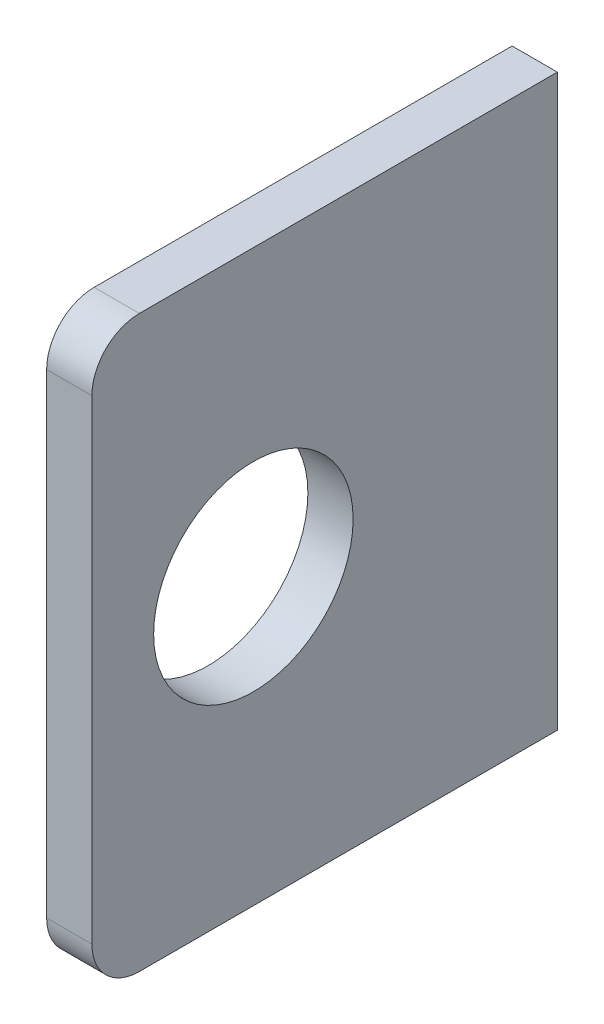
ISO-10303-21;
HEADER;
FILE_DESCRIPTION(('STEP AP214'),'2;1');
FILE_NAME('part.step','',(''),(''),'','','');
FILE_SCHEMA(('AUTOMOTIVE_DESIGN { 1 0 10303 214 1 1 1 1 }'));
ENDSEC;
DATA;
#1=APPLICATION_CONTEXT('core data for automotive mechanical design processes');
#2=APPLICATION_PROTOCOL_DEFINITION('international standard','automotive_design',2000,#1);
#3=PRODUCT_CONTEXT('',#1,'mechanical');
#4=PRODUCT('Part','Part','',(#3));
#5=PRODUCT_RELATED_PRODUCT_CATEGORY('part','',(#4));
#6=PRODUCT_DEFINITION_FORMATION('','',#4);
#7=PRODUCT_DEFINITION_CONTEXT('part definition',#1,'design');
#8=PRODUCT_DEFINITION('design','',#6,#7);
#9=PRODUCT_DEFINITION_SHAPE('','',#8);
#10=(LENGTH_UNIT() NAMED_UNIT(*) SI_UNIT(.MILLI.,.METRE.));
#11=(NAMED_UNIT(*) PLANE_ANGLE_UNIT() SI_UNIT($,.RADIAN.));
#12=(NAMED_UNIT(*) SI_UNIT($,.STERADIAN.) SOLID_ANGLE_UNIT());
#13=UNCERTAINTY_MEASURE_WITH_UNIT(LENGTH_MEASURE(1.E-05),#10,'distance_accuracy_value','');
#14=(GEOMETRIC_REPRESENTATION_CONTEXT(3) GLOBAL_UNCERTAINTY_ASSIGNED_CONTEXT((#13)) GLOBAL_UNIT_ASSIGNED_CONTEXT((#10,
#11,#12)) REPRESENTATION_CONTEXT('',''));
#15=CARTESIAN_POINT('',(0.,0.,0.));
#16=DIRECTION('',(0.,0.,1.));
#17=DIRECTION('',(1.,0.,0.));
#18=AXIS2_PLACEMENT_3D('',#15,#16,#17);
#19=CARTESIAN_POINT('',(9.525,-60.,-58.));
#20=DIRECTION('',(0.,1.,0.));
#21=DIRECTION('',(0.,0.,1.));
#22=AXIS2_PLACEMENT_3D('',#19,#20,#21);
#23=PLANE('',#22);
#24=DIRECTION('',(0.,0.,-1.));
#25=VECTOR('',#24,1.);
#26=CARTESIAN_POINT('',(9.525,-60.,-58.));
#27=LINE('',#26,#25);
#28=CARTESIAN_POINT('',(9.525,-60.,30.));
#29=VERTEX_POINT('',#28);
#30=CARTESIAN_POINT('',(9.525,-60.,-58.));
#31=VERTEX_POINT('',#30);
#32=EDGE_CURVE('E101',#29,#31,#27,.T.);
#33=ORIENTED_EDGE('',*,*,#32,.F.);
#34=DIRECTION('',(1.,0.,0.));
#35=VECTOR('',#34,1.);
#36=CARTESIAN_POINT('',(9.525,-60.,30.));
#37=LINE('',#36,#35);
#38=CARTESIAN_POINT('',(0.,-60.,30.));
#39=VERTEX_POINT('',#38);
#40=EDGE_CURVE('E67',#29,#39,#37,.F.);
#41=ORIENTED_EDGE('',*,*,#40,.T.);
#42=DIRECTION('',(0.,0.,-1.));
#43=VECTOR('',#42,1.);
#44=CARTESIAN_POINT('',(0.,-60.,-58.));
#45=LINE('',#44,#43);
#46=CARTESIAN_POINT('',(0.,-60.,-58.));
#47=VERTEX_POINT('',#46);
#48=EDGE_CURVE('E113',#39,#47,#45,.T.);
#49=ORIENTED_EDGE('',*,*,#48,.T.);
#50=DIRECTION('',(-1.,0.,0.));
#51=VECTOR('',#50,1.);
#52=CARTESIAN_POINT('',(9.525,-60.,-58.));
#53=LINE('',#52,#51);
#54=EDGE_CURVE('E111',#31,#47,#53,.T.);
#55=ORIENTED_EDGE('',*,*,#54,.F.);
#56=EDGE_LOOP('',(#33,#41,#49,#55));
#57=FACE_BOUND('',#56,.T.);
#58=ADVANCED_FACE('F46',(#57),#23,.F.);
#59=CARTESIAN_POINT('',(9.525,0.,0.));
#60=DIRECTION('',(-1.,0.,0.));
#61=DIRECTION('',(0.,0.,1.));
#62=AXIS2_PLACEMENT_3D('',#59,#60,#61);
#63=PLANE('',#62);
#64=CARTESIAN_POINT('',(9.525,0.,6.00000000000001));
#65=DIRECTION('',(1.,0.,0.));
#66=DIRECTION('',(0.,0.,-1.));
#67=AXIS2_PLACEMENT_3D('',#64,#65,#66);
#68=CIRCLE('',#67,21.);
#69=CARTESIAN_POINT('',(9.525,0.,-15.));
#70=VERTEX_POINT('',#69);
#71=EDGE_CURVE('E167',#70,#70,#68,.T.);
#72=ORIENTED_EDGE('',*,*,#71,.F.);
#73=EDGE_LOOP('',(#72));
#74=FACE_BOUND('',#73,.T.);
#75=DIRECTION('',(0.,1.,0.));
#76=VECTOR('',#75,1.);
#77=CARTESIAN_POINT('',(9.525,-60.,40.));
#78=LINE('',#77,#76);
#79=CARTESIAN_POINT('',(9.525,-50.,40.));
#80=VERTEX_POINT('',#79);
#81=CARTESIAN_POINT('',(9.525,50.,40.));
#82=VERTEX_POINT('',#81);
#83=EDGE_CURVE('E170',#80,#82,#78,.T.);
#84=ORIENTED_EDGE('',*,*,#83,.F.);
#85=CARTESIAN_POINT('',(9.525,-50.,30.));
#86=DIRECTION('',(-1.,0.,0.));
#87=DIRECTION('',(0.,0.,1.));
#88=AXIS2_PLACEMENT_3D('',#85,#86,#87);
#89=CIRCLE('',#88,10.);
#90=EDGE_CURVE('E108',#80,#29,#89,.F.);
#91=ORIENTED_EDGE('',*,*,#90,.T.);
#92=ORIENTED_EDGE('',*,*,#32,.T.);
#93=DIRECTION('',(0.,1.,0.));
#94=VECTOR('',#93,1.);
#95=CARTESIAN_POINT('',(9.525,-60.,-58.));
#96=LINE('',#95,#94);
#97=CARTESIAN_POINT('',(9.525,60.,-58.));
#98=VERTEX_POINT('',#97);
#99=EDGE_CURVE('E110',#31,#98,#96,.T.);
#100=ORIENTED_EDGE('',*,*,#99,.T.);
#101=DIRECTION('',(0.,0.,1.));
#102=VECTOR('',#101,1.);
#103=CARTESIAN_POINT('',(9.525,60.,-58.));
#104=LINE('',#103,#102);
#105=CARTESIAN_POINT('',(9.525,60.,30.));
#106=VERTEX_POINT('',#105);
#107=EDGE_CURVE('E112',#98,#106,#104,.T.);
#108=ORIENTED_EDGE('',*,*,#107,.T.);
#109=CARTESIAN_POINT('',(9.525,50.,30.));
#110=DIRECTION('',(-1.,0.,0.));
#111=DIRECTION('',(0.,0.,1.));
#112=AXIS2_PLACEMENT_3D('',#109,#110,#111);
#113=CIRCLE('',#112,10.);
#114=EDGE_CURVE('E148',#106,#82,#113,.F.);
#115=ORIENTED_EDGE('',*,*,#114,.T.);
#116=EDGE_LOOP('',(#84,#91,#92,#100,#108,#115));
#117=FACE_BOUND('',#116,.T.);
#118=ADVANCED_FACE('F102',(#74,#117),#63,.F.);
#119=CARTESIAN_POINT('',(0.,0.,0.));
#120=DIRECTION('',(-1.,0.,0.));
#121=DIRECTION('',(0.,0.,1.));
#122=AXIS2_PLACEMENT_3D('',#119,#120,#121);
#123=PLANE('',#122);
#124=CARTESIAN_POINT('',(0.,0.,6.00000000000001));
#125=DIRECTION('',(1.,0.,0.));
#126=DIRECTION('',(0.,0.,-1.));
#127=AXIS2_PLACEMENT_3D('',#124,#125,#126);
#128=CIRCLE('',#127,21.);
#129=CARTESIAN_POINT('',(0.,0.,-15.));
#130=VERTEX_POINT('',#129);
#131=EDGE_CURVE('E201',#130,#130,#128,.T.);
#132=ORIENTED_EDGE('',*,*,#131,.T.);
#133=EDGE_LOOP('',(#132));
#134=FACE_BOUND('',#133,.T.);
#135=ORIENTED_EDGE('',*,*,#48,.F.);
#136=CARTESIAN_POINT('',(0.,-50.,30.));
#137=DIRECTION('',(-1.,0.,0.));
#138=DIRECTION('',(0.,0.,1.));
#139=AXIS2_PLACEMENT_3D('',#136,#137,#138);
#140=CIRCLE('',#139,10.);
#141=CARTESIAN_POINT('',(0.,-50.,40.));
#142=VERTEX_POINT('',#141);
#143=EDGE_CURVE('E54',#39,#142,#140,.T.);
#144=ORIENTED_EDGE('',*,*,#143,.T.);
#145=DIRECTION('',(0.,1.,0.));
#146=VECTOR('',#145,1.);
#147=CARTESIAN_POINT('',(0.,-60.,40.));
#148=LINE('',#147,#146);
#149=CARTESIAN_POINT('',(0.,50.,40.));
#150=VERTEX_POINT('',#149);
#151=EDGE_CURVE('E158',#142,#150,#148,.T.);
#152=ORIENTED_EDGE('',*,*,#151,.T.);
#153=CARTESIAN_POINT('',(0.,50.,30.));
#154=DIRECTION('',(-1.,0.,0.));
#155=DIRECTION('',(0.,0.,1.));
#156=AXIS2_PLACEMENT_3D('',#153,#154,#155);
#157=CIRCLE('',#156,10.);
#158=CARTESIAN_POINT('',(0.,60.,30.));
#159=VERTEX_POINT('',#158);
#160=EDGE_CURVE('E61',#150,#159,#157,.T.);
#161=ORIENTED_EDGE('',*,*,#160,.T.);
#162=DIRECTION('',(0.,0.,1.));
#163=VECTOR('',#162,1.);
#164=CARTESIAN_POINT('',(0.,60.,-58.));
#165=LINE('',#164,#163);
#166=CARTESIAN_POINT('',(0.,60.,-58.));
#167=VERTEX_POINT('',#166);
#168=EDGE_CURVE('E134',#167,#159,#165,.T.);
#169=ORIENTED_EDGE('',*,*,#168,.F.);
#170=DIRECTION('',(0.,1.,0.));
#171=VECTOR('',#170,1.);
#172=CARTESIAN_POINT('',(0.,-60.,-58.));
#173=LINE('',#172,#171);
#174=EDGE_CURVE('E136',#47,#167,#173,.T.);
#175=ORIENTED_EDGE('',*,*,#174,.F.);
#176=EDGE_LOOP('',(#135,#144,#152,#161,#169,#175));
#177=FACE_BOUND('',#176,.T.);
#178=ADVANCED_FACE('F160',(#134,#177),#123,.T.);
#179=CARTESIAN_POINT('',(9.525,60.,-58.));
#180=DIRECTION('',(0.,-1.,0.));
#181=DIRECTION('',(0.,0.,-1.));
#182=AXIS2_PLACEMENT_3D('',#179,#180,#181);
#183=PLANE('',#182);
#184=ORIENTED_EDGE('',*,*,#168,.T.);
#185=DIRECTION('',(1.,0.,0.));
#186=VECTOR('',#185,1.);
#187=CARTESIAN_POINT('',(9.525,60.,30.));
#188=LINE('',#187,#186);
#189=EDGE_CURVE('E11',#159,#106,#188,.T.);
#190=ORIENTED_EDGE('',*,*,#189,.T.);
#191=ORIENTED_EDGE('',*,*,#107,.F.);
#192=DIRECTION('',(-1.,0.,0.));
#193=VECTOR('',#192,1.);
#194=CARTESIAN_POINT('',(9.525,60.,-58.));
#195=LINE('',#194,#193);
#196=EDGE_CURVE('E117',#98,#167,#195,.T.);
#197=ORIENTED_EDGE('',*,*,#196,.T.);
#198=EDGE_LOOP('',(#184,#190,#191,#197));
#199=FACE_BOUND('',#198,.T.);
#200=ADVANCED_FACE('F188',(#199),#183,.F.);
#201=CARTESIAN_POINT('',(9.525,-60.,-58.));
#202=DIRECTION('',(0.,0.,1.));
#203=DIRECTION('',(1.,0.,0.));
#204=AXIS2_PLACEMENT_3D('',#201,#202,#203);
#205=PLANE('',#204);
#206=CARTESIAN_POINT('',(4.76250000000001,0.,-58.));
#207=DIRECTION('',(0.,0.,-1.));
#208=DIRECTION('',(-1.,0.,0.));
#209=AXIS2_PLACEMENT_3D('',#206,#207,#208);
#210=CIRCLE('',#209,1.65);
#211=CARTESIAN_POINT('',(3.11250000000001,0.,-58.));
#212=VERTEX_POINT('',#211);
#213=EDGE_CURVE('E226',#212,#212,#210,.T.);
#214=ORIENTED_EDGE('',*,*,#213,.F.);
#215=EDGE_LOOP('',(#214));
#216=FACE_BOUND('',#215,.T.);
#217=CARTESIAN_POINT('',(4.76250000000001,27.,-58.));
#218=DIRECTION('',(0.,0.,-1.));
#219=DIRECTION('',(-1.,0.,0.));
#220=AXIS2_PLACEMENT_3D('',#217,#218,#219);
#221=CIRCLE('',#220,1.65);
#222=CARTESIAN_POINT('',(3.11250000000001,27.,-58.));
#223=VERTEX_POINT('',#222);
#224=EDGE_CURVE('E237',#223,#223,#221,.T.);
#225=ORIENTED_EDGE('',*,*,#224,.F.);
#226=EDGE_LOOP('',(#225));
#227=FACE_BOUND('',#226,.T.);
#228=CARTESIAN_POINT('',(4.76250000000001,54.,-58.));
#229=DIRECTION('',(0.,0.,-1.));
#230=DIRECTION('',(-1.,0.,0.));
#231=AXIS2_PLACEMENT_3D('',#228,#229,#230);
#232=CIRCLE('',#231,1.65);
#233=CARTESIAN_POINT('',(3.11250000000001,54.,-58.));
#234=VERTEX_POINT('',#233);
#235=EDGE_CURVE('E211',#234,#234,#232,.T.);
#236=ORIENTED_EDGE('',*,*,#235,.F.);
#237=EDGE_LOOP('',(#236));
#238=FACE_BOUND('',#237,.T.);
#239=CARTESIAN_POINT('',(4.76250000000001,-54.,-58.));
#240=DIRECTION('',(0.,0.,-1.));
#241=DIRECTION('',(-1.,0.,0.));
#242=AXIS2_PLACEMENT_3D('',#239,#240,#241);
#243=CIRCLE('',#242,1.65);
#244=CARTESIAN_POINT('',(3.11250000000001,-54.,-58.));
#245=VERTEX_POINT('',#244);
#246=EDGE_CURVE('E219',#245,#245,#243,.T.);
#247=ORIENTED_EDGE('',*,*,#246,.F.);
#248=EDGE_LOOP('',(#247));
#249=FACE_BOUND('',#248,.T.);
#250=CARTESIAN_POINT('',(4.76250000000001,-27.,-58.));
#251=DIRECTION('',(0.,0.,-1.));
#252=DIRECTION('',(-1.,0.,0.));
#253=AXIS2_PLACEMENT_3D('',#250,#251,#252);
#254=CIRCLE('',#253,1.65);
#255=CARTESIAN_POINT('',(3.11250000000001,-27.,-58.));
#256=VERTEX_POINT('',#255);
#257=EDGE_CURVE('E234',#256,#256,#254,.T.);
#258=ORIENTED_EDGE('',*,*,#257,.F.);
#259=EDGE_LOOP('',(#258));
#260=FACE_BOUND('',#259,.T.);
#261=ORIENTED_EDGE('',*,*,#174,.T.);
#262=ORIENTED_EDGE('',*,*,#196,.F.);
#263=ORIENTED_EDGE('',*,*,#99,.F.);
#264=ORIENTED_EDGE('',*,*,#54,.T.);
#265=EDGE_LOOP('',(#261,#262,#263,#264));
#266=FACE_BOUND('',#265,.T.);
#267=ADVANCED_FACE('F121',(#216,#227,#238,#249,#260,#266),#205,.F.);
#268=CARTESIAN_POINT('',(4.76250000000001,-27.,-48.));
#269=DIRECTION('',(0.,0.,-1.));
#270=DIRECTION('',(-1.,0.,0.));
#271=AXIS2_PLACEMENT_3D('',#268,#269,#270);
#272=CYLINDRICAL_SURFACE('',#271,1.65);
#273=CARTESIAN_POINT('',(4.76250000000001,-27.,-48.));
#274=DIRECTION('',(0.,0.,-1.));
#275=DIRECTION('',(-1.,0.,0.));
#276=AXIS2_PLACEMENT_3D('',#273,#274,#275);
#277=CIRCLE('',#276,1.65);
#278=CARTESIAN_POINT('',(3.11250000000001,-27.,-48.));
#279=VERTEX_POINT('',#278);
#280=EDGE_CURVE('E133',#279,#279,#277,.T.);
#281=ORIENTED_EDGE('',*,*,#280,.F.);
#282=EDGE_LOOP('',(#281));
#283=FACE_BOUND('',#282,.T.);
#284=ORIENTED_EDGE('',*,*,#257,.T.);
#285=EDGE_LOOP('',(#284));
#286=FACE_BOUND('',#285,.T.);
#287=ADVANCED_FACE('F198',(#283,#286),#272,.F.);
#288=CARTESIAN_POINT('',(0.,0.,-48.));
#289=DIRECTION('',(0.,0.,-1.));
#290=DIRECTION('',(-1.,0.,0.));
#291=AXIS2_PLACEMENT_3D('',#288,#289,#290);
#292=PLANE('',#291);
#293=ORIENTED_EDGE('',*,*,#280,.T.);
#294=EDGE_LOOP('',(#293));
#295=FACE_BOUND('',#294,.T.);
#296=ADVANCED_FACE('F251',(#295),#292,.T.);
#297=CARTESIAN_POINT('',(4.76250000000001,-54.,-48.));
#298=DIRECTION('',(0.,0.,-1.));
#299=DIRECTION('',(-1.,0.,0.));
#300=AXIS2_PLACEMENT_3D('',#297,#298,#299);
#301=CYLINDRICAL_SURFACE('',#300,1.65);
#302=CARTESIAN_POINT('',(4.76250000000001,-54.,-48.));
#303=DIRECTION('',(0.,0.,-1.));
#304=DIRECTION('',(-1.,0.,0.));
#305=AXIS2_PLACEMENT_3D('',#302,#303,#304);
#306=CIRCLE('',#305,1.65);
#307=CARTESIAN_POINT('',(3.11250000000001,-54.,-48.));
#308=VERTEX_POINT('',#307);
#309=EDGE_CURVE('E210',#308,#308,#306,.T.);
#310=ORIENTED_EDGE('',*,*,#309,.F.);
#311=EDGE_LOOP('',(#310));
#312=FACE_BOUND('',#311,.T.);
#313=ORIENTED_EDGE('',*,*,#246,.T.);
#314=EDGE_LOOP('',(#313));
#315=FACE_BOUND('',#314,.T.);
#316=ADVANCED_FACE('F257',(#312,#315),#301,.F.);
#317=CARTESIAN_POINT('',(4.76250000000001,-54.,-48.));
#318=DIRECTION('',(0.,0.,-1.));
#319=DIRECTION('',(-1.,0.,0.));
#320=AXIS2_PLACEMENT_3D('',#317,#318,#319);
#321=PLANE('',#320);
#322=ORIENTED_EDGE('',*,*,#309,.T.);
#323=EDGE_LOOP('',(#322));
#324=FACE_BOUND('',#323,.T.);
#325=ADVANCED_FACE('F281',(#324),#321,.T.);
#326=CARTESIAN_POINT('',(4.76250000000001,54.,-48.));
#327=DIRECTION('',(0.,0.,-1.));
#328=DIRECTION('',(-1.,0.,0.));
#329=AXIS2_PLACEMENT_3D('',#326,#327,#328);
#330=CYLINDRICAL_SURFACE('',#329,1.65);
#331=CARTESIAN_POINT('',(4.76250000000001,54.,-48.));
#332=DIRECTION('',(0.,0.,-1.));
#333=DIRECTION('',(-1.,0.,0.));
#334=AXIS2_PLACEMENT_3D('',#331,#332,#333);
#335=CIRCLE('',#334,1.65);
#336=CARTESIAN_POINT('',(3.11250000000001,54.,-48.));
#337=VERTEX_POINT('',#336);
#338=EDGE_CURVE('E216',#337,#337,#335,.T.);
#339=ORIENTED_EDGE('',*,*,#338,.F.);
#340=EDGE_LOOP('',(#339));
#341=FACE_BOUND('',#340,.T.);
#342=ORIENTED_EDGE('',*,*,#235,.T.);
#343=EDGE_LOOP('',(#342));
#344=FACE_BOUND('',#343,.T.);
#345=ADVANCED_FACE('F282',(#341,#344),#330,.F.);
#346=CARTESIAN_POINT('',(0.,0.,-48.));
#347=DIRECTION('',(0.,0.,-1.));
#348=DIRECTION('',(-1.,0.,0.));
#349=AXIS2_PLACEMENT_3D('',#346,#347,#348);
#350=PLANE('',#349);
#351=ORIENTED_EDGE('',*,*,#338,.T.);
#352=EDGE_LOOP('',(#351));
#353=FACE_BOUND('',#352,.T.);
#354=ADVANCED_FACE('F272',(#353),#350,.T.);
#355=CARTESIAN_POINT('',(4.76250000000001,27.,-48.));
#356=DIRECTION('',(0.,0.,-1.));
#357=DIRECTION('',(-1.,0.,0.));
#358=AXIS2_PLACEMENT_3D('',#355,#356,#357);
#359=CYLINDRICAL_SURFACE('',#358,1.65);
#360=CARTESIAN_POINT('',(4.76250000000001,27.,-48.));
#361=DIRECTION('',(0.,0.,-1.));
#362=DIRECTION('',(-1.,0.,0.));
#363=AXIS2_PLACEMENT_3D('',#360,#361,#362);
#364=CIRCLE('',#363,1.65);
#365=CARTESIAN_POINT('',(3.11250000000001,27.,-48.));
#366=VERTEX_POINT('',#365);
#367=EDGE_CURVE('E214',#366,#366,#364,.T.);
#368=ORIENTED_EDGE('',*,*,#367,.F.);
#369=EDGE_LOOP('',(#368));
#370=FACE_BOUND('',#369,.T.);
#371=ORIENTED_EDGE('',*,*,#224,.T.);
#372=EDGE_LOOP('',(#371));
#373=FACE_BOUND('',#372,.T.);
#374=ADVANCED_FACE('F267',(#370,#373),#359,.F.);
#375=CARTESIAN_POINT('',(0.,0.,-48.));
#376=DIRECTION('',(0.,0.,-1.));
#377=DIRECTION('',(-1.,0.,0.));
#378=AXIS2_PLACEMENT_3D('',#375,#376,#377);
#379=PLANE('',#378);
#380=ORIENTED_EDGE('',*,*,#367,.T.);
#381=EDGE_LOOP('',(#380));
#382=FACE_BOUND('',#381,.T.);
#383=ADVANCED_FACE('F264',(#382),#379,.T.);
#384=CARTESIAN_POINT('',(4.76250000000001,0.,-48.));
#385=DIRECTION('',(0.,0.,-1.));
#386=DIRECTION('',(-1.,0.,0.));
#387=AXIS2_PLACEMENT_3D('',#384,#385,#386);
#388=CYLINDRICAL_SURFACE('',#387,1.65);
#389=CARTESIAN_POINT('',(4.76250000000001,0.,-48.));
#390=DIRECTION('',(0.,0.,-1.));
#391=DIRECTION('',(-1.,0.,0.));
#392=AXIS2_PLACEMENT_3D('',#389,#390,#391);
#393=CIRCLE('',#392,1.65);
#394=CARTESIAN_POINT('',(3.11250000000001,0.,-48.));
#395=VERTEX_POINT('',#394);
#396=EDGE_CURVE('E231',#395,#395,#393,.T.);
#397=ORIENTED_EDGE('',*,*,#396,.F.);
#398=EDGE_LOOP('',(#397));
#399=FACE_BOUND('',#398,.T.);
#400=ORIENTED_EDGE('',*,*,#213,.T.);
#401=EDGE_LOOP('',(#400));
#402=FACE_BOUND('',#401,.T.);
#403=ADVANCED_FACE('F268',(#399,#402),#388,.F.);
#404=CARTESIAN_POINT('',(0.,0.,-48.));
#405=DIRECTION('',(0.,0.,-1.));
#406=DIRECTION('',(-1.,0.,0.));
#407=AXIS2_PLACEMENT_3D('',#404,#405,#406);
#408=PLANE('',#407);
#409=ORIENTED_EDGE('',*,*,#396,.T.);
#410=EDGE_LOOP('',(#409));
#411=FACE_BOUND('',#410,.T.);
#412=ADVANCED_FACE('F274',(#411),#408,.T.);
#413=CARTESIAN_POINT('',(0.,0.,6.00000000000001));
#414=DIRECTION('',(1.,0.,0.));
#415=DIRECTION('',(0.,0.,-1.));
#416=AXIS2_PLACEMENT_3D('',#413,#414,#415);
#417=CYLINDRICAL_SURFACE('',#416,21.);
#418=CARTESIAN_POINT('',(0.,0.,-15.));
#419=CARTESIAN_POINT('',(0.0992187499999999,0.,-15.));
#420=CARTESIAN_POINT('',(0.1984375,0.,-15.));
#421=CARTESIAN_POINT('',(0.396875,0.,-15.));
#422=CARTESIAN_POINT('',(0.49609375,0.,-15.));
#423=CARTESIAN_POINT('',(0.69453125,0.,-15.));
#424=CARTESIAN_POINT('',(0.79375,0.,-15.));
#425=CARTESIAN_POINT('',(0.9921875,0.,-15.));
#426=CARTESIAN_POINT('',(1.09140625,0.,-15.));
#427=CARTESIAN_POINT('',(1.28984375,0.,-15.));
#428=CARTESIAN_POINT('',(1.3890625,0.,-15.));
#429=CARTESIAN_POINT('',(1.5875,0.,-15.));
#430=CARTESIAN_POINT('',(1.68671875,0.,-15.));
#431=CARTESIAN_POINT('',(1.88515625,0.,-15.));
#432=CARTESIAN_POINT('',(1.984375,0.,-15.));
#433=CARTESIAN_POINT('',(2.1828125,0.,-15.));
#434=CARTESIAN_POINT('',(2.28203125,0.,-15.));
#435=CARTESIAN_POINT('',(2.48046875,0.,-15.));
#436=CARTESIAN_POINT('',(2.5796875,0.,-15.));
#437=CARTESIAN_POINT('',(2.778125,0.,-15.));
#438=CARTESIAN_POINT('',(2.87734375,0.,-15.));
#439=CARTESIAN_POINT('',(3.07578125,0.,-15.));
#440=CARTESIAN_POINT('',(3.175,0.,-15.));
#441=CARTESIAN_POINT('',(3.3734375,0.,-15.));
#442=CARTESIAN_POINT('',(3.47265625,0.,-15.));
#443=CARTESIAN_POINT('',(3.67109375,0.,-15.));
#444=CARTESIAN_POINT('',(3.7703125,0.,-15.));
#445=CARTESIAN_POINT('',(3.96875,0.,-15.));
#446=CARTESIAN_POINT('',(4.06796875,0.,-15.));
#447=CARTESIAN_POINT('',(4.26640625,0.,-15.));
#448=CARTESIAN_POINT('',(4.365625,0.,-15.));
#449=CARTESIAN_POINT('',(4.5640625,0.,-15.));
#450=CARTESIAN_POINT('',(4.66328125,0.,-15.));
#451=CARTESIAN_POINT('',(4.86171875,0.,-15.));
#452=CARTESIAN_POINT('',(4.9609375,0.,-15.));
#453=CARTESIAN_POINT('',(5.159375,0.,-15.));
#454=CARTESIAN_POINT('',(5.25859375,0.,-15.));
#455=CARTESIAN_POINT('',(5.45703125,0.,-15.));
#456=CARTESIAN_POINT('',(5.55625,0.,-15.));
#457=CARTESIAN_POINT('',(5.7546875,0.,-15.));
#458=CARTESIAN_POINT('',(5.85390625,0.,-15.));
#459=CARTESIAN_POINT('',(6.05234375,0.,-15.));
#460=CARTESIAN_POINT('',(6.1515625,0.,-15.));
#461=CARTESIAN_POINT('',(6.35,0.,-15.));
#462=CARTESIAN_POINT('',(6.44921875,0.,-15.));
#463=CARTESIAN_POINT('',(6.64765625,0.,-15.));
#464=CARTESIAN_POINT('',(6.746875,0.,-15.));
#465=CARTESIAN_POINT('',(6.9453125,0.,-15.));
#466=CARTESIAN_POINT('',(7.04453125,0.,-15.));
#467=CARTESIAN_POINT('',(7.24296875,0.,-15.));
#468=CARTESIAN_POINT('',(7.3421875,0.,-15.));
#469=CARTESIAN_POINT('',(7.540625,0.,-15.));
#470=CARTESIAN_POINT('',(7.63984375,0.,-15.));
#471=CARTESIAN_POINT('',(7.83828125,0.,-15.));
#472=CARTESIAN_POINT('',(7.9375,0.,-15.));
#473=CARTESIAN_POINT('',(8.1359375,0.,-15.));
#474=CARTESIAN_POINT('',(8.23515625,0.,-15.));
#475=CARTESIAN_POINT('',(8.43359375,0.,-15.));
#476=CARTESIAN_POINT('',(8.5328125,0.,-15.));
#477=CARTESIAN_POINT('',(8.73125,0.,-15.));
#478=CARTESIAN_POINT('',(8.83046875,0.,-15.));
#479=CARTESIAN_POINT('',(9.02890625,0.,-15.));
#480=CARTESIAN_POINT('',(9.128125,0.,-15.));
#481=CARTESIAN_POINT('',(9.3265625,0.,-15.));
#482=CARTESIAN_POINT('',(9.42578125,0.,-15.));
#483=CARTESIAN_POINT('',(9.525,0.,-15.));
#484=B_SPLINE_CURVE_WITH_KNOTS('',3,(#418,#419,#420,#421,#422,#423,#424,#425,#426,#427,#428,
#429,#430,#431,#432,#433,#434,#435,#436,#437,#438,#439,#440,#441,#442,#443,#444,#445,#446,#447,
#448,#449,#450,#451,#452,#453,#454,#455,#456,#457,#458,#459,#460,#461,#462,#463,#464,#465,#466,
#467,#468,#469,#470,#471,#472,#473,#474,#475,#476,#477,#478,#479,#480,#481,#482,#483),
.UNSPECIFIED.,.F.,.F.,(4,2,2,2,2,2,2,2,2,2,2,2,2,2,2,2,2,2,2,2,2,2,2,2,2,2,2,2,2,2,2,2,4),(0.,
0.29765625,0.5953125,0.89296875,1.190625,1.48828125,1.7859375,2.08359375,2.38125,2.67890625,
2.9765625,3.27421875,3.571875,3.86953125,4.1671875,4.46484375,4.7625,5.06015625,5.3578125,
5.65546875,5.953125,6.25078125,6.5484375,6.84609375,7.14375,7.44140625,7.7390625,8.03671875,
8.334375,8.63203125,8.9296875,9.22734375,9.525),.UNSPECIFIED.);
#485=EDGE_CURVE('BSEAM179',#130,#70,#484,.T.);
#486=ORIENTED_EDGE('',*,*,#131,.F.);
#487=ORIENTED_EDGE('',*,*,#71,.T.);
#488=ORIENTED_EDGE('',*,*,#485,.T.);
#489=ORIENTED_EDGE('',*,*,#485,.F.);
#490=EDGE_LOOP('',(#486,#488,#487,#489));
#491=FACE_BOUND('',#490,.T.);
#492=ADVANCED_FACE('F179',(#491),#417,.F.);
#493=CARTESIAN_POINT('',(0.,-60.,40.));
#494=DIRECTION('',(0.,0.,-1.));
#495=DIRECTION('',(-1.,0.,0.));
#496=AXIS2_PLACEMENT_3D('',#493,#494,#495);
#497=PLANE('',#496);
#498=ORIENTED_EDGE('',*,*,#151,.F.);
#499=DIRECTION('',(1.,0.,0.));
#500=VECTOR('',#499,1.);
#501=CARTESIAN_POINT('',(0.,-50.,40.));
#502=LINE('',#501,#500);
#503=EDGE_CURVE('E142',#142,#80,#502,.T.);
#504=ORIENTED_EDGE('',*,*,#503,.T.);
#505=ORIENTED_EDGE('',*,*,#83,.T.);
#506=DIRECTION('',(1.,0.,0.));
#507=VECTOR('',#506,1.);
#508=CARTESIAN_POINT('',(0.,50.,40.));
#509=LINE('',#508,#507);
#510=EDGE_CURVE('E118',#82,#150,#509,.F.);
#511=ORIENTED_EDGE('',*,*,#510,.T.);
#512=EDGE_LOOP('',(#498,#504,#505,#511));
#513=FACE_BOUND('',#512,.T.);
#514=ADVANCED_FACE('F165',(#513),#497,.F.);
#515=CARTESIAN_POINT('',(0.,-50.,30.));
#516=DIRECTION('',(1.,0.,0.));
#517=DIRECTION('',(0.,0.,-1.));
#518=AXIS2_PLACEMENT_3D('',#515,#516,#517);
#519=CYLINDRICAL_SURFACE('',#518,10.);
#520=ORIENTED_EDGE('',*,*,#143,.F.);
#521=ORIENTED_EDGE('',*,*,#40,.F.);
#522=ORIENTED_EDGE('',*,*,#90,.F.);
#523=ORIENTED_EDGE('',*,*,#503,.F.);
#524=EDGE_LOOP('',(#520,#521,#522,#523));
#525=FACE_BOUND('',#524,.T.);
#526=ADVANCED_FACE('F166',(#525),#519,.T.);
#527=CARTESIAN_POINT('',(9.525,50.,30.));
#528=DIRECTION('',(1.,0.,0.));
#529=DIRECTION('',(0.,0.,-1.));
#530=AXIS2_PLACEMENT_3D('',#527,#528,#529);
#531=CYLINDRICAL_SURFACE('',#530,10.);
#532=ORIENTED_EDGE('',*,*,#160,.F.);
#533=ORIENTED_EDGE('',*,*,#510,.F.);
#534=ORIENTED_EDGE('',*,*,#114,.F.);
#535=ORIENTED_EDGE('',*,*,#189,.F.);
#536=EDGE_LOOP('',(#532,#533,#534,#535));
#537=FACE_BOUND('',#536,.T.);
#538=ADVANCED_FACE('F48',(#537),#531,.T.);
#539=CLOSED_SHELL('',(#58,#118,#178,#200,#267,#287,#296,#316,#325,#345,#354,#374,#383,#403,#412,
#492,#514,#526,#538));
#540=MANIFOLD_SOLID_BREP('B2',#539);
#541=ADVANCED_BREP_SHAPE_REPRESENTATION('',(#18,#540),#14);
#542=SHAPE_DEFINITION_REPRESENTATION(#9,#541);
ENDSEC;
END-ISO-10303-21;
